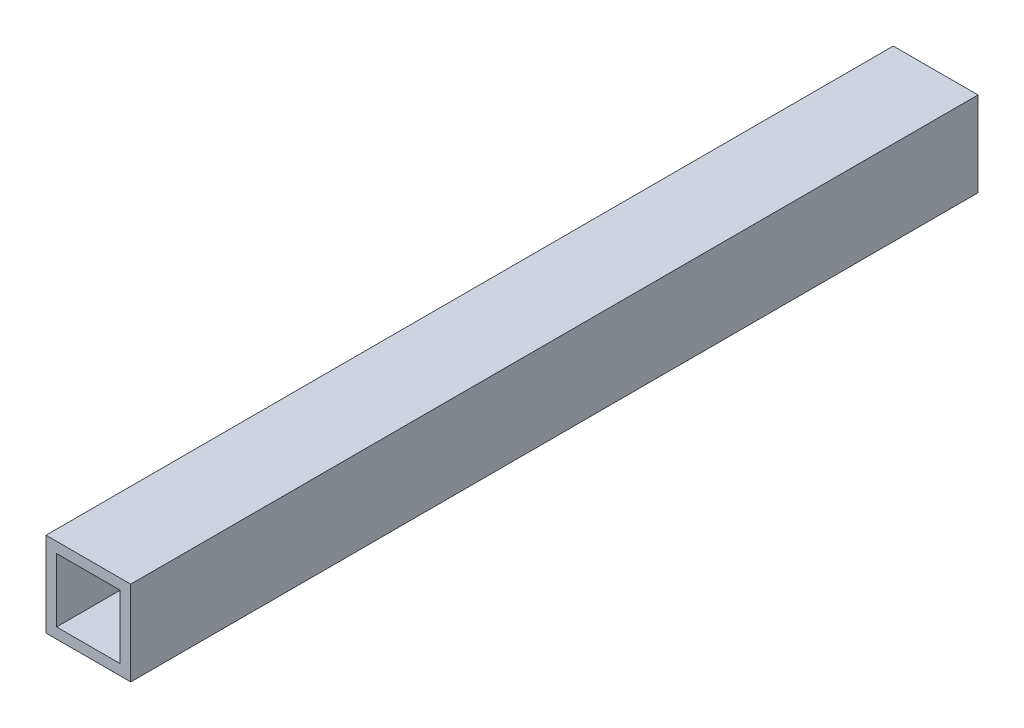
ISO-10303-21;
HEADER;
FILE_DESCRIPTION(('STEP AP214'),'2;1');
FILE_NAME('part.step','',(''),(''),'','','');
FILE_SCHEMA(('AUTOMOTIVE_DESIGN { 1 0 10303 214 1 1 1 1 }'));
ENDSEC;
DATA;
#1=APPLICATION_CONTEXT('core data for automotive mechanical design processes');
#2=APPLICATION_PROTOCOL_DEFINITION('international standard','automotive_design',2000,#1);
#3=PRODUCT_CONTEXT('',#1,'mechanical');
#4=PRODUCT('Part','Part','',(#3));
#5=PRODUCT_RELATED_PRODUCT_CATEGORY('part','',(#4));
#6=PRODUCT_DEFINITION_FORMATION('','',#4);
#7=PRODUCT_DEFINITION_CONTEXT('part definition',#1,'design');
#8=PRODUCT_DEFINITION('design','',#6,#7);
#9=PRODUCT_DEFINITION_SHAPE('','',#8);
#10=(LENGTH_UNIT() NAMED_UNIT(*) SI_UNIT(.MILLI.,.METRE.));
#11=(NAMED_UNIT(*) PLANE_ANGLE_UNIT() SI_UNIT($,.RADIAN.));
#12=(NAMED_UNIT(*) SI_UNIT($,.STERADIAN.) SOLID_ANGLE_UNIT());
#13=UNCERTAINTY_MEASURE_WITH_UNIT(LENGTH_MEASURE(1.E-05),#10,'distance_accuracy_value','');
#14=(GEOMETRIC_REPRESENTATION_CONTEXT(3) GLOBAL_UNCERTAINTY_ASSIGNED_CONTEXT((#13)) GLOBAL_UNIT_ASSIGNED_CONTEXT((#10,
#11,#12)) REPRESENTATION_CONTEXT('',''));
#15=CARTESIAN_POINT('',(0.,0.,0.));
#16=DIRECTION('',(0.,0.,1.));
#17=DIRECTION('',(1.,0.,0.));
#18=AXIS2_PLACEMENT_3D('',#15,#16,#17);
#19=CARTESIAN_POINT('',(0.,0.,127.));
#20=DIRECTION('',(0.,0.,1.));
#21=DIRECTION('',(1.,0.,0.));
#22=AXIS2_PLACEMENT_3D('',#19,#20,#21);
#23=PLANE('',#22);
#24=DIRECTION('',(0.,-1.,0.));
#25=VECTOR('',#24,1.);
#26=CARTESIAN_POINT('',(-12.7,-12.7,127.));
#27=LINE('',#26,#25);
#28=CARTESIAN_POINT('',(-12.7,12.7,127.));
#29=VERTEX_POINT('',#28);
#30=CARTESIAN_POINT('',(-12.7,-12.7,127.));
#31=VERTEX_POINT('',#30);
#32=EDGE_CURVE('E112',#29,#31,#27,.T.);
#33=ORIENTED_EDGE('',*,*,#32,.T.);
#34=DIRECTION('',(1.,0.,0.));
#35=VECTOR('',#34,1.);
#36=CARTESIAN_POINT('',(12.7,-12.7,127.));
#37=LINE('',#36,#35);
#38=CARTESIAN_POINT('',(12.7,-12.7,127.));
#39=VERTEX_POINT('',#38);
#40=EDGE_CURVE('E155',#31,#39,#37,.T.);
#41=ORIENTED_EDGE('',*,*,#40,.T.);
#42=DIRECTION('',(0.,1.,0.));
#43=VECTOR('',#42,1.);
#44=CARTESIAN_POINT('',(12.7,-12.7,127.));
#45=LINE('',#44,#43);
#46=CARTESIAN_POINT('',(12.7,12.7,127.));
#47=VERTEX_POINT('',#46);
#48=EDGE_CURVE('E157',#39,#47,#45,.T.);
#49=ORIENTED_EDGE('',*,*,#48,.T.);
#50=DIRECTION('',(-1.,0.,0.));
#51=VECTOR('',#50,1.);
#52=CARTESIAN_POINT('',(12.7,12.7,127.));
#53=LINE('',#52,#51);
#54=EDGE_CURVE('E59',#47,#29,#53,.T.);
#55=ORIENTED_EDGE('',*,*,#54,.T.);
#56=EDGE_LOOP('',(#33,#41,#49,#55));
#57=FACE_BOUND('',#56,.T.);
#58=DIRECTION('',(1.,0.,0.));
#59=VECTOR('',#58,1.);
#60=CARTESIAN_POINT('',(9.525,-9.525,127.));
#61=LINE('',#60,#59);
#62=CARTESIAN_POINT('',(-9.52499999999999,-9.525,127.));
#63=VERTEX_POINT('',#62);
#64=CARTESIAN_POINT('',(9.525,-9.525,127.));
#65=VERTEX_POINT('',#64);
#66=EDGE_CURVE('E144',#63,#65,#61,.T.);
#67=ORIENTED_EDGE('',*,*,#66,.F.);
#68=DIRECTION('',(0.,-1.,0.));
#69=VECTOR('',#68,1.);
#70=CARTESIAN_POINT('',(-9.52499999999999,-9.525,127.));
#71=LINE('',#70,#69);
#72=CARTESIAN_POINT('',(-9.52499999999999,9.525,127.));
#73=VERTEX_POINT('',#72);
#74=EDGE_CURVE('E109',#73,#63,#71,.T.);
#75=ORIENTED_EDGE('',*,*,#74,.F.);
#76=DIRECTION('',(-1.,0.,0.));
#77=VECTOR('',#76,1.);
#78=CARTESIAN_POINT('',(9.525,9.525,127.));
#79=LINE('',#78,#77);
#80=CARTESIAN_POINT('',(9.525,9.525,127.));
#81=VERTEX_POINT('',#80);
#82=EDGE_CURVE('E148',#81,#73,#79,.T.);
#83=ORIENTED_EDGE('',*,*,#82,.F.);
#84=DIRECTION('',(0.,1.,0.));
#85=VECTOR('',#84,1.);
#86=CARTESIAN_POINT('',(9.525,-9.525,127.));
#87=LINE('',#86,#85);
#88=EDGE_CURVE('E146',#65,#81,#87,.T.);
#89=ORIENTED_EDGE('',*,*,#88,.F.);
#90=EDGE_LOOP('',(#67,#75,#83,#89));
#91=FACE_BOUND('',#90,.T.);
#92=ADVANCED_FACE('F36',(#57,#91),#23,.T.);
#93=CARTESIAN_POINT('',(-12.7,-12.7,127.));
#94=DIRECTION('',(1.,0.,0.));
#95=DIRECTION('',(0.,0.,-1.));
#96=AXIS2_PLACEMENT_3D('',#93,#94,#95);
#97=PLANE('',#96);
#98=DIRECTION('',(0.,0.,-1.));
#99=VECTOR('',#98,1.);
#100=CARTESIAN_POINT('',(-12.7,12.7,127.));
#101=LINE('',#100,#99);
#102=CARTESIAN_POINT('',(-12.7,12.7,-127.));
#103=VERTEX_POINT('',#102);
#104=EDGE_CURVE('E160',#29,#103,#101,.T.);
#105=ORIENTED_EDGE('',*,*,#104,.T.);
#106=DIRECTION('',(0.,-1.,0.));
#107=VECTOR('',#106,1.);
#108=CARTESIAN_POINT('',(-12.7,-12.7,-127.));
#109=LINE('',#108,#107);
#110=CARTESIAN_POINT('',(-12.7,-12.7,-127.));
#111=VERTEX_POINT('',#110);
#112=EDGE_CURVE('E131',#103,#111,#109,.T.);
#113=ORIENTED_EDGE('',*,*,#112,.T.);
#114=DIRECTION('',(0.,0.,-1.));
#115=VECTOR('',#114,1.);
#116=CARTESIAN_POINT('',(-12.7,-12.7,127.));
#117=LINE('',#116,#115);
#118=EDGE_CURVE('E11',#31,#111,#117,.T.);
#119=ORIENTED_EDGE('',*,*,#118,.F.);
#120=ORIENTED_EDGE('',*,*,#32,.F.);
#121=EDGE_LOOP('',(#105,#113,#119,#120));
#122=FACE_BOUND('',#121,.T.);
#123=ADVANCED_FACE('F38',(#122),#97,.F.);
#124=CARTESIAN_POINT('',(12.7,-12.7,127.));
#125=DIRECTION('',(0.,1.,0.));
#126=DIRECTION('',(0.,0.,1.));
#127=AXIS2_PLACEMENT_3D('',#124,#125,#126);
#128=PLANE('',#127);
#129=ORIENTED_EDGE('',*,*,#118,.T.);
#130=DIRECTION('',(1.,0.,0.));
#131=VECTOR('',#130,1.);
#132=CARTESIAN_POINT('',(12.7,-12.7,-127.));
#133=LINE('',#132,#131);
#134=CARTESIAN_POINT('',(12.7,-12.7,-127.));
#135=VERTEX_POINT('',#134);
#136=EDGE_CURVE('E134',#111,#135,#133,.T.);
#137=ORIENTED_EDGE('',*,*,#136,.T.);
#138=DIRECTION('',(0.,0.,-1.));
#139=VECTOR('',#138,1.);
#140=CARTESIAN_POINT('',(12.7,-12.7,127.));
#141=LINE('',#140,#139);
#142=EDGE_CURVE('E44',#39,#135,#141,.T.);
#143=ORIENTED_EDGE('',*,*,#142,.F.);
#144=ORIENTED_EDGE('',*,*,#40,.F.);
#145=EDGE_LOOP('',(#129,#137,#143,#144));
#146=FACE_BOUND('',#145,.T.);
#147=ADVANCED_FACE('F173',(#146),#128,.F.);
#148=CARTESIAN_POINT('',(12.7,-12.7,127.));
#149=DIRECTION('',(-1.,0.,0.));
#150=DIRECTION('',(0.,0.,1.));
#151=AXIS2_PLACEMENT_3D('',#148,#149,#150);
#152=PLANE('',#151);
#153=ORIENTED_EDGE('',*,*,#142,.T.);
#154=DIRECTION('',(0.,1.,0.));
#155=VECTOR('',#154,1.);
#156=CARTESIAN_POINT('',(12.7,-12.7,-127.));
#157=LINE('',#156,#155);
#158=CARTESIAN_POINT('',(12.7,12.7,-127.));
#159=VERTEX_POINT('',#158);
#160=EDGE_CURVE('E137',#135,#159,#157,.T.);
#161=ORIENTED_EDGE('',*,*,#160,.T.);
#162=DIRECTION('',(0.,0.,-1.));
#163=VECTOR('',#162,1.);
#164=CARTESIAN_POINT('',(12.7,12.7,127.));
#165=LINE('',#164,#163);
#166=EDGE_CURVE('E162',#47,#159,#165,.T.);
#167=ORIENTED_EDGE('',*,*,#166,.F.);
#168=ORIENTED_EDGE('',*,*,#48,.F.);
#169=EDGE_LOOP('',(#153,#161,#167,#168));
#170=FACE_BOUND('',#169,.T.);
#171=ADVANCED_FACE('F167',(#170),#152,.F.);
#172=CARTESIAN_POINT('',(12.7,12.7,127.));
#173=DIRECTION('',(0.,-1.,0.));
#174=DIRECTION('',(0.,0.,-1.));
#175=AXIS2_PLACEMENT_3D('',#172,#173,#174);
#176=PLANE('',#175);
#177=ORIENTED_EDGE('',*,*,#166,.T.);
#178=DIRECTION('',(-1.,0.,0.));
#179=VECTOR('',#178,1.);
#180=CARTESIAN_POINT('',(12.7,12.7,-127.));
#181=LINE('',#180,#179);
#182=EDGE_CURVE('E140',#159,#103,#181,.T.);
#183=ORIENTED_EDGE('',*,*,#182,.T.);
#184=ORIENTED_EDGE('',*,*,#104,.F.);
#185=ORIENTED_EDGE('',*,*,#54,.F.);
#186=EDGE_LOOP('',(#177,#183,#184,#185));
#187=FACE_BOUND('',#186,.T.);
#188=ADVANCED_FACE('F178',(#187),#176,.F.);
#189=CARTESIAN_POINT('',(-9.52499999999999,-9.525,127.));
#190=DIRECTION('',(1.,0.,0.));
#191=DIRECTION('',(0.,0.,-1.));
#192=AXIS2_PLACEMENT_3D('',#189,#190,#191);
#193=PLANE('',#192);
#194=DIRECTION('',(0.,0.,-1.));
#195=VECTOR('',#194,1.);
#196=CARTESIAN_POINT('',(-9.52499999999999,-9.525,127.));
#197=LINE('',#196,#195);
#198=CARTESIAN_POINT('',(-9.52499999999999,-9.525,-127.));
#199=VERTEX_POINT('',#198);
#200=EDGE_CURVE('E101',#63,#199,#197,.T.);
#201=ORIENTED_EDGE('',*,*,#200,.T.);
#202=DIRECTION('',(0.,-1.,0.));
#203=VECTOR('',#202,1.);
#204=CARTESIAN_POINT('',(-9.52499999999999,-9.525,-127.));
#205=LINE('',#204,#203);
#206=CARTESIAN_POINT('',(-9.52499999999999,9.525,-127.));
#207=VERTEX_POINT('',#206);
#208=EDGE_CURVE('E106',#207,#199,#205,.T.);
#209=ORIENTED_EDGE('',*,*,#208,.F.);
#210=DIRECTION('',(0.,0.,-1.));
#211=VECTOR('',#210,1.);
#212=CARTESIAN_POINT('',(-9.52499999999999,9.525,127.));
#213=LINE('',#212,#211);
#214=EDGE_CURVE('E150',#73,#207,#213,.T.);
#215=ORIENTED_EDGE('',*,*,#214,.F.);
#216=ORIENTED_EDGE('',*,*,#74,.T.);
#217=EDGE_LOOP('',(#201,#209,#215,#216));
#218=FACE_BOUND('',#217,.T.);
#219=ADVANCED_FACE('F103',(#218),#193,.T.);
#220=CARTESIAN_POINT('',(9.525,-9.525,127.));
#221=DIRECTION('',(0.,1.,0.));
#222=DIRECTION('',(0.,0.,1.));
#223=AXIS2_PLACEMENT_3D('',#220,#221,#222);
#224=PLANE('',#223);
#225=DIRECTION('',(0.,0.,-1.));
#226=VECTOR('',#225,1.);
#227=CARTESIAN_POINT('',(9.525,-9.525,127.));
#228=LINE('',#227,#226);
#229=CARTESIAN_POINT('',(9.525,-9.525,-127.));
#230=VERTEX_POINT('',#229);
#231=EDGE_CURVE('E113',#65,#230,#228,.T.);
#232=ORIENTED_EDGE('',*,*,#231,.T.);
#233=DIRECTION('',(1.,0.,0.));
#234=VECTOR('',#233,1.);
#235=CARTESIAN_POINT('',(9.525,-9.525,-127.));
#236=LINE('',#235,#234);
#237=EDGE_CURVE('E116',#199,#230,#236,.T.);
#238=ORIENTED_EDGE('',*,*,#237,.F.);
#239=ORIENTED_EDGE('',*,*,#200,.F.);
#240=ORIENTED_EDGE('',*,*,#66,.T.);
#241=EDGE_LOOP('',(#232,#238,#239,#240));
#242=FACE_BOUND('',#241,.T.);
#243=ADVANCED_FACE('F117',(#242),#224,.T.);
#244=CARTESIAN_POINT('',(9.525,-9.525,127.));
#245=DIRECTION('',(-1.,0.,0.));
#246=DIRECTION('',(0.,0.,1.));
#247=AXIS2_PLACEMENT_3D('',#244,#245,#246);
#248=PLANE('',#247);
#249=DIRECTION('',(0.,0.,-1.));
#250=VECTOR('',#249,1.);
#251=CARTESIAN_POINT('',(9.525,9.525,127.));
#252=LINE('',#251,#250);
#253=CARTESIAN_POINT('',(9.525,9.525,-127.));
#254=VERTEX_POINT('',#253);
#255=EDGE_CURVE('E51',#81,#254,#252,.T.);
#256=ORIENTED_EDGE('',*,*,#255,.T.);
#257=DIRECTION('',(0.,1.,0.));
#258=VECTOR('',#257,1.);
#259=CARTESIAN_POINT('',(9.525,-9.525,-127.));
#260=LINE('',#259,#258);
#261=EDGE_CURVE('E122',#230,#254,#260,.T.);
#262=ORIENTED_EDGE('',*,*,#261,.F.);
#263=ORIENTED_EDGE('',*,*,#231,.F.);
#264=ORIENTED_EDGE('',*,*,#88,.T.);
#265=EDGE_LOOP('',(#256,#262,#263,#264));
#266=FACE_BOUND('',#265,.T.);
#267=ADVANCED_FACE('F196',(#266),#248,.T.);
#268=CARTESIAN_POINT('',(9.525,9.525,127.));
#269=DIRECTION('',(0.,-1.,0.));
#270=DIRECTION('',(0.,0.,-1.));
#271=AXIS2_PLACEMENT_3D('',#268,#269,#270);
#272=PLANE('',#271);
#273=ORIENTED_EDGE('',*,*,#214,.T.);
#274=DIRECTION('',(-1.,0.,0.));
#275=VECTOR('',#274,1.);
#276=CARTESIAN_POINT('',(9.525,9.525,-127.));
#277=LINE('',#276,#275);
#278=EDGE_CURVE('E126',#254,#207,#277,.T.);
#279=ORIENTED_EDGE('',*,*,#278,.F.);
#280=ORIENTED_EDGE('',*,*,#255,.F.);
#281=ORIENTED_EDGE('',*,*,#82,.T.);
#282=EDGE_LOOP('',(#273,#279,#280,#281));
#283=FACE_BOUND('',#282,.T.);
#284=ADVANCED_FACE('F199',(#283),#272,.T.);
#285=CARTESIAN_POINT('',(0.,0.,-127.));
#286=DIRECTION('',(0.,0.,1.));
#287=DIRECTION('',(1.,0.,0.));
#288=AXIS2_PLACEMENT_3D('',#285,#286,#287);
#289=PLANE('',#288);
#290=ORIENTED_EDGE('',*,*,#278,.T.);
#291=ORIENTED_EDGE('',*,*,#208,.T.);
#292=ORIENTED_EDGE('',*,*,#237,.T.);
#293=ORIENTED_EDGE('',*,*,#261,.T.);
#294=EDGE_LOOP('',(#290,#291,#292,#293));
#295=FACE_BOUND('',#294,.T.);
#296=ORIENTED_EDGE('',*,*,#112,.F.);
#297=ORIENTED_EDGE('',*,*,#182,.F.);
#298=ORIENTED_EDGE('',*,*,#160,.F.);
#299=ORIENTED_EDGE('',*,*,#136,.F.);
#300=EDGE_LOOP('',(#296,#297,#298,#299));
#301=FACE_BOUND('',#300,.T.);
#302=ADVANCED_FACE('F124',(#295,#301),#289,.F.);
#303=CLOSED_SHELL('',(#92,#123,#147,#171,#188,#219,#243,#267,#284,#302));
#304=MANIFOLD_SOLID_BREP('B2',#303);
#305=ADVANCED_BREP_SHAPE_REPRESENTATION('',(#18,#304),#14);
#306=SHAPE_DEFINITION_REPRESENTATION(#9,#305);
ENDSEC;
END-ISO-10303-21;
